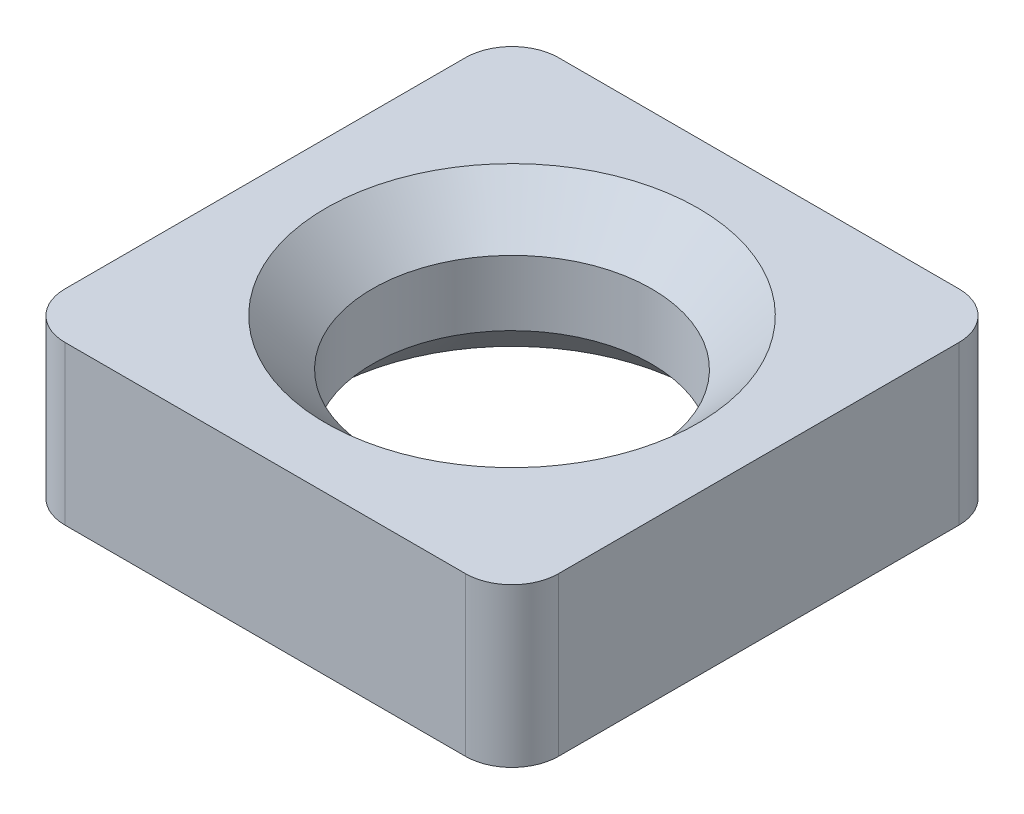
ISO-10303-21;
HEADER;
FILE_DESCRIPTION(('STEP AP214'),'2;1');
FILE_NAME('part.step','',(''),(''),'','','');
FILE_SCHEMA(('AUTOMOTIVE_DESIGN { 1 0 10303 214 1 1 1 1 }'));
ENDSEC;
DATA;
#1=APPLICATION_CONTEXT('core data for automotive mechanical design processes');
#2=APPLICATION_PROTOCOL_DEFINITION('international standard','automotive_design',2000,#1);
#3=PRODUCT_CONTEXT('',#1,'mechanical');
#4=PRODUCT('Part','Part','',(#3));
#5=PRODUCT_RELATED_PRODUCT_CATEGORY('part','',(#4));
#6=PRODUCT_DEFINITION_FORMATION('','',#4);
#7=PRODUCT_DEFINITION_CONTEXT('part definition',#1,'design');
#8=PRODUCT_DEFINITION('design','',#6,#7);
#9=PRODUCT_DEFINITION_SHAPE('','',#8);
#10=(LENGTH_UNIT() NAMED_UNIT(*) SI_UNIT(.MILLI.,.METRE.));
#11=(NAMED_UNIT(*) PLANE_ANGLE_UNIT() SI_UNIT($,.RADIAN.));
#12=(NAMED_UNIT(*) SI_UNIT($,.STERADIAN.) SOLID_ANGLE_UNIT());
#13=UNCERTAINTY_MEASURE_WITH_UNIT(LENGTH_MEASURE(1.E-05),#10,'distance_accuracy_value','');
#14=(GEOMETRIC_REPRESENTATION_CONTEXT(3) GLOBAL_UNCERTAINTY_ASSIGNED_CONTEXT((#13)) GLOBAL_UNIT_ASSIGNED_CONTEXT((#10,
#11,#12)) REPRESENTATION_CONTEXT('',''));
#15=CARTESIAN_POINT('',(0.,0.,0.));
#16=DIRECTION('',(0.,0.,1.));
#17=DIRECTION('',(1.,0.,0.));
#18=AXIS2_PLACEMENT_3D('',#15,#16,#17);
#19=CARTESIAN_POINT('',(0.,1.7,0.));
#20=DIRECTION('',(0.,-1.,0.));
#21=DIRECTION('',(0.,0.,-1.));
#22=AXIS2_PLACEMENT_3D('',#19,#20,#21);
#23=PLANE('',#22);
#24=CARTESIAN_POINT('',(0.,1.7,0.));
#25=DIRECTION('',(0.,-1.,0.));
#26=DIRECTION('',(0.,0.,-1.));
#27=AXIS2_PLACEMENT_3D('',#24,#25,#26);
#28=CIRCLE('',#27,2.);
#29=CARTESIAN_POINT('',(0.,1.7,-2.));
#30=VERTEX_POINT('',#29);
#31=EDGE_CURVE('E11',#30,#30,#28,.T.);
#32=ORIENTED_EDGE('',*,*,#31,.T.);
#33=EDGE_LOOP('',(#32));
#34=FACE_BOUND('',#33,.T.);
#35=DIRECTION('',(-1.,0.,0.));
#36=VECTOR('',#35,1.);
#37=CARTESIAN_POINT('',(-2.65,1.7,-2.65));
#38=LINE('',#37,#36);
#39=CARTESIAN_POINT('',(2.15,1.7,-2.65));
#40=VERTEX_POINT('',#39);
#41=CARTESIAN_POINT('',(-2.15,1.7,-2.65));
#42=VERTEX_POINT('',#41);
#43=EDGE_CURVE('E232',#40,#42,#38,.T.);
#44=ORIENTED_EDGE('',*,*,#43,.T.);
#45=CARTESIAN_POINT('',(-2.15,1.7,-2.15));
#46=DIRECTION('',(0.,-1.,0.));
#47=DIRECTION('',(0.,0.,-1.));
#48=AXIS2_PLACEMENT_3D('',#45,#46,#47);
#49=CIRCLE('',#48,0.5);
#50=CARTESIAN_POINT('',(-2.65,1.7,-2.15));
#51=VERTEX_POINT('',#50);
#52=EDGE_CURVE('E154',#42,#51,#49,.F.);
#53=ORIENTED_EDGE('',*,*,#52,.T.);
#54=DIRECTION('',(0.,0.,1.));
#55=VECTOR('',#54,1.);
#56=CARTESIAN_POINT('',(-2.65,1.7,2.65));
#57=LINE('',#56,#55);
#58=CARTESIAN_POINT('',(-2.65,1.7,2.15));
#59=VERTEX_POINT('',#58);
#60=EDGE_CURVE('E125',#51,#59,#57,.T.);
#61=ORIENTED_EDGE('',*,*,#60,.T.);
#62=CARTESIAN_POINT('',(-2.15,1.7,2.15));
#63=DIRECTION('',(0.,-1.,0.));
#64=DIRECTION('',(0.,0.,-1.));
#65=AXIS2_PLACEMENT_3D('',#62,#63,#64);
#66=CIRCLE('',#65,0.5);
#67=CARTESIAN_POINT('',(-2.15,1.7,2.65));
#68=VERTEX_POINT('',#67);
#69=EDGE_CURVE('E61',#59,#68,#66,.F.);
#70=ORIENTED_EDGE('',*,*,#69,.T.);
#71=DIRECTION('',(1.,0.,0.));
#72=VECTOR('',#71,1.);
#73=CARTESIAN_POINT('',(-2.65,1.7,2.65));
#74=LINE('',#73,#72);
#75=CARTESIAN_POINT('',(2.15,1.7,2.65));
#76=VERTEX_POINT('',#75);
#77=EDGE_CURVE('E140',#68,#76,#74,.T.);
#78=ORIENTED_EDGE('',*,*,#77,.T.);
#79=CARTESIAN_POINT('',(2.15,1.7,2.15));
#80=DIRECTION('',(0.,-1.,0.));
#81=DIRECTION('',(0.,0.,-1.));
#82=AXIS2_PLACEMENT_3D('',#79,#80,#81);
#83=CIRCLE('',#82,0.5);
#84=CARTESIAN_POINT('',(2.65,1.7,2.15));
#85=VERTEX_POINT('',#84);
#86=EDGE_CURVE('E149',#76,#85,#83,.F.);
#87=ORIENTED_EDGE('',*,*,#86,.T.);
#88=DIRECTION('',(0.,0.,-1.));
#89=VECTOR('',#88,1.);
#90=CARTESIAN_POINT('',(2.65,1.7,2.65));
#91=LINE('',#90,#89);
#92=CARTESIAN_POINT('',(2.65,1.7,-2.15));
#93=VERTEX_POINT('',#92);
#94=EDGE_CURVE('E134',#85,#93,#91,.T.);
#95=ORIENTED_EDGE('',*,*,#94,.T.);
#96=CARTESIAN_POINT('',(2.15,1.7,-2.15));
#97=DIRECTION('',(0.,-1.,0.));
#98=DIRECTION('',(0.,0.,-1.));
#99=AXIS2_PLACEMENT_3D('',#96,#97,#98);
#100=CIRCLE('',#99,0.5);
#101=EDGE_CURVE('E151',#93,#40,#100,.F.);
#102=ORIENTED_EDGE('',*,*,#101,.T.);
#103=EDGE_LOOP('',(#44,#53,#61,#70,#78,#87,#95,#102));
#104=FACE_BOUND('',#103,.T.);
#105=ADVANCED_FACE('F38',(#34,#104),#23,.F.);
#106=CARTESIAN_POINT('',(0.,0.,0.));
#107=DIRECTION('',(0.,-1.,0.));
#108=DIRECTION('',(0.,0.,-1.));
#109=AXIS2_PLACEMENT_3D('',#106,#107,#108);
#110=PLANE('',#109);
#111=CARTESIAN_POINT('',(0.,0.,0.));
#112=DIRECTION('',(0.,-1.,0.));
#113=DIRECTION('',(0.,0.,-1.));
#114=AXIS2_PLACEMENT_3D('',#111,#112,#113);
#115=CIRCLE('',#114,2.);
#116=CARTESIAN_POINT('',(0.,0.,-2.));
#117=VERTEX_POINT('',#116);
#118=EDGE_CURVE('E165',#117,#117,#115,.F.);
#119=ORIENTED_EDGE('',*,*,#118,.T.);
#120=EDGE_LOOP('',(#119));
#121=FACE_BOUND('',#120,.T.);
#122=DIRECTION('',(0.,0.,1.));
#123=VECTOR('',#122,1.);
#124=CARTESIAN_POINT('',(-2.65,0.,2.65));
#125=LINE('',#124,#123);
#126=CARTESIAN_POINT('',(-2.65,0.,-2.15));
#127=VERTEX_POINT('',#126);
#128=CARTESIAN_POINT('',(-2.65,0.,2.15));
#129=VERTEX_POINT('',#128);
#130=EDGE_CURVE('E123',#127,#129,#125,.T.);
#131=ORIENTED_EDGE('',*,*,#130,.F.);
#132=CARTESIAN_POINT('',(-2.15,0.,-2.15));
#133=DIRECTION('',(0.,-1.,0.));
#134=DIRECTION('',(0.,0.,-1.));
#135=AXIS2_PLACEMENT_3D('',#132,#133,#134);
#136=CIRCLE('',#135,0.5);
#137=CARTESIAN_POINT('',(-2.15,0.,-2.65));
#138=VERTEX_POINT('',#137);
#139=EDGE_CURVE('E106',#127,#138,#136,.T.);
#140=ORIENTED_EDGE('',*,*,#139,.T.);
#141=DIRECTION('',(-1.,0.,0.));
#142=VECTOR('',#141,1.);
#143=CARTESIAN_POINT('',(-2.65,0.,-2.65));
#144=LINE('',#143,#142);
#145=CARTESIAN_POINT('',(2.15,0.,-2.65));
#146=VERTEX_POINT('',#145);
#147=EDGE_CURVE('E132',#146,#138,#144,.T.);
#148=ORIENTED_EDGE('',*,*,#147,.F.);
#149=CARTESIAN_POINT('',(2.15,0.,-2.15));
#150=DIRECTION('',(0.,-1.,0.));
#151=DIRECTION('',(0.,0.,-1.));
#152=AXIS2_PLACEMENT_3D('',#149,#150,#151);
#153=CIRCLE('',#152,0.5);
#154=CARTESIAN_POINT('',(2.65,0.,-2.15));
#155=VERTEX_POINT('',#154);
#156=EDGE_CURVE('E143',#146,#155,#153,.T.);
#157=ORIENTED_EDGE('',*,*,#156,.T.);
#158=DIRECTION('',(0.,0.,-1.));
#159=VECTOR('',#158,1.);
#160=CARTESIAN_POINT('',(2.65,0.,2.65));
#161=LINE('',#160,#159);
#162=CARTESIAN_POINT('',(2.65,0.,2.15));
#163=VERTEX_POINT('',#162);
#164=EDGE_CURVE('E136',#163,#155,#161,.T.);
#165=ORIENTED_EDGE('',*,*,#164,.F.);
#166=CARTESIAN_POINT('',(2.15,0.,2.15));
#167=DIRECTION('',(0.,-1.,0.));
#168=DIRECTION('',(0.,0.,-1.));
#169=AXIS2_PLACEMENT_3D('',#166,#167,#168);
#170=CIRCLE('',#169,0.5);
#171=CARTESIAN_POINT('',(2.15,0.,2.65));
#172=VERTEX_POINT('',#171);
#173=EDGE_CURVE('E126',#163,#172,#170,.T.);
#174=ORIENTED_EDGE('',*,*,#173,.T.);
#175=DIRECTION('',(1.,0.,0.));
#176=VECTOR('',#175,1.);
#177=CARTESIAN_POINT('',(-2.65,0.,2.65));
#178=LINE('',#177,#176);
#179=CARTESIAN_POINT('',(-2.15,0.,2.65));
#180=VERTEX_POINT('',#179);
#181=EDGE_CURVE('E131',#180,#172,#178,.T.);
#182=ORIENTED_EDGE('',*,*,#181,.F.);
#183=CARTESIAN_POINT('',(-2.15,0.,2.15));
#184=DIRECTION('',(0.,-1.,0.));
#185=DIRECTION('',(0.,0.,-1.));
#186=AXIS2_PLACEMENT_3D('',#183,#184,#185);
#187=CIRCLE('',#186,0.5);
#188=EDGE_CURVE('E117',#180,#129,#187,.T.);
#189=ORIENTED_EDGE('',*,*,#188,.T.);
#190=EDGE_LOOP('',(#131,#140,#148,#157,#165,#174,#182,#189));
#191=FACE_BOUND('',#190,.T.);
#192=ADVANCED_FACE('F129',(#121,#191),#110,.T.);
#193=CARTESIAN_POINT('',(2.65,1.7,2.65));
#194=DIRECTION('',(-1.,0.,0.));
#195=DIRECTION('',(0.,0.,1.));
#196=AXIS2_PLACEMENT_3D('',#193,#194,#195);
#197=PLANE('',#196);
#198=ORIENTED_EDGE('',*,*,#164,.T.);
#199=DIRECTION('',(0.,-1.,0.));
#200=VECTOR('',#199,1.);
#201=CARTESIAN_POINT('',(2.65,1.7,-2.15));
#202=LINE('',#201,#200);
#203=EDGE_CURVE('E163',#155,#93,#202,.F.);
#204=ORIENTED_EDGE('',*,*,#203,.T.);
#205=ORIENTED_EDGE('',*,*,#94,.F.);
#206=DIRECTION('',(0.,-1.,0.));
#207=VECTOR('',#206,1.);
#208=CARTESIAN_POINT('',(2.65,1.7,2.15));
#209=LINE('',#208,#207);
#210=EDGE_CURVE('E160',#85,#163,#209,.T.);
#211=ORIENTED_EDGE('',*,*,#210,.T.);
#212=EDGE_LOOP('',(#198,#204,#205,#211));
#213=FACE_BOUND('',#212,.T.);
#214=ADVANCED_FACE('F183',(#213),#197,.F.);
#215=CARTESIAN_POINT('',(-2.65,1.7,-2.65));
#216=DIRECTION('',(0.,0.,1.));
#217=DIRECTION('',(1.,0.,0.));
#218=AXIS2_PLACEMENT_3D('',#215,#216,#217);
#219=PLANE('',#218);
#220=ORIENTED_EDGE('',*,*,#147,.T.);
#221=DIRECTION('',(0.,-1.,0.));
#222=VECTOR('',#221,1.);
#223=CARTESIAN_POINT('',(-2.15,1.7,-2.65));
#224=LINE('',#223,#222);
#225=EDGE_CURVE('E111',#138,#42,#224,.F.);
#226=ORIENTED_EDGE('',*,*,#225,.T.);
#227=ORIENTED_EDGE('',*,*,#43,.F.);
#228=DIRECTION('',(0.,-1.,0.));
#229=VECTOR('',#228,1.);
#230=CARTESIAN_POINT('',(2.15,1.7,-2.65));
#231=LINE('',#230,#229);
#232=EDGE_CURVE('E116',#40,#146,#231,.T.);
#233=ORIENTED_EDGE('',*,*,#232,.T.);
#234=EDGE_LOOP('',(#220,#226,#227,#233));
#235=FACE_BOUND('',#234,.T.);
#236=ADVANCED_FACE('F189',(#235),#219,.F.);
#237=CARTESIAN_POINT('',(-2.65,1.7,2.65));
#238=DIRECTION('',(1.,0.,0.));
#239=DIRECTION('',(0.,0.,-1.));
#240=AXIS2_PLACEMENT_3D('',#237,#238,#239);
#241=PLANE('',#240);
#242=ORIENTED_EDGE('',*,*,#60,.F.);
#243=DIRECTION('',(0.,-1.,0.));
#244=VECTOR('',#243,1.);
#245=CARTESIAN_POINT('',(-2.65,1.7,-2.15));
#246=LINE('',#245,#244);
#247=EDGE_CURVE('E110',#51,#127,#246,.T.);
#248=ORIENTED_EDGE('',*,*,#247,.T.);
#249=ORIENTED_EDGE('',*,*,#130,.T.);
#250=DIRECTION('',(0.,-1.,0.));
#251=VECTOR('',#250,1.);
#252=CARTESIAN_POINT('',(-2.65,1.7,2.15));
#253=LINE('',#252,#251);
#254=EDGE_CURVE('E127',#129,#59,#253,.F.);
#255=ORIENTED_EDGE('',*,*,#254,.T.);
#256=EDGE_LOOP('',(#242,#248,#249,#255));
#257=FACE_BOUND('',#256,.T.);
#258=ADVANCED_FACE('F122',(#257),#241,.F.);
#259=CARTESIAN_POINT('',(-2.65,1.7,2.65));
#260=DIRECTION('',(0.,0.,-1.));
#261=DIRECTION('',(-1.,0.,0.));
#262=AXIS2_PLACEMENT_3D('',#259,#260,#261);
#263=PLANE('',#262);
#264=ORIENTED_EDGE('',*,*,#77,.F.);
#265=DIRECTION('',(0.,-1.,0.));
#266=VECTOR('',#265,1.);
#267=CARTESIAN_POINT('',(-2.15,1.7,2.65));
#268=LINE('',#267,#266);
#269=EDGE_CURVE('E157',#68,#180,#268,.T.);
#270=ORIENTED_EDGE('',*,*,#269,.T.);
#271=ORIENTED_EDGE('',*,*,#181,.T.);
#272=DIRECTION('',(0.,-1.,0.));
#273=VECTOR('',#272,1.);
#274=CARTESIAN_POINT('',(2.15,1.7,2.65));
#275=LINE('',#274,#273);
#276=EDGE_CURVE('E54',#172,#76,#275,.F.);
#277=ORIENTED_EDGE('',*,*,#276,.T.);
#278=EDGE_LOOP('',(#264,#270,#271,#277));
#279=FACE_BOUND('',#278,.T.);
#280=ADVANCED_FACE('F196',(#279),#263,.F.);
#281=CARTESIAN_POINT('',(0.,1.7,0.));
#282=DIRECTION('',(0.,-1.,0.));
#283=DIRECTION('',(0.,0.,-1.));
#284=AXIS2_PLACEMENT_3D('',#281,#282,#283);
#285=CYLINDRICAL_SURFACE('',#284,1.5);
#286=CARTESIAN_POINT('',(0.,0.500000000000002,0.));
#287=DIRECTION('',(0.,-1.,0.));
#288=DIRECTION('',(0.,0.,-1.));
#289=AXIS2_PLACEMENT_3D('',#286,#287,#288);
#290=CIRCLE('',#289,1.5);
#291=CARTESIAN_POINT('',(0.,0.500000000000002,-1.5));
#292=VERTEX_POINT('',#291);
#293=EDGE_CURVE('E47',#292,#292,#290,.T.);
#294=ORIENTED_EDGE('',*,*,#293,.T.);
#295=EDGE_LOOP('',(#294));
#296=FACE_BOUND('',#295,.T.);
#297=CARTESIAN_POINT('',(0.,1.2,0.));
#298=DIRECTION('',(0.,-1.,0.));
#299=DIRECTION('',(0.,0.,-1.));
#300=AXIS2_PLACEMENT_3D('',#297,#298,#299);
#301=CIRCLE('',#300,1.5);
#302=CARTESIAN_POINT('',(0.,1.2,-1.5));
#303=VERTEX_POINT('',#302);
#304=EDGE_CURVE('E168',#303,#303,#301,.F.);
#305=ORIENTED_EDGE('',*,*,#304,.T.);
#306=EDGE_LOOP('',(#305));
#307=FACE_BOUND('',#306,.T.);
#308=ADVANCED_FACE('F173',(#296,#307),#285,.F.);
#309=CARTESIAN_POINT('',(-2.15,1.7,-2.15));
#310=DIRECTION('',(0.,-1.,0.));
#311=DIRECTION('',(0.,0.,-1.));
#312=AXIS2_PLACEMENT_3D('',#309,#310,#311);
#313=CYLINDRICAL_SURFACE('',#312,0.5);
#314=ORIENTED_EDGE('',*,*,#52,.F.);
#315=ORIENTED_EDGE('',*,*,#225,.F.);
#316=ORIENTED_EDGE('',*,*,#139,.F.);
#317=ORIENTED_EDGE('',*,*,#247,.F.);
#318=EDGE_LOOP('',(#314,#315,#316,#317));
#319=FACE_BOUND('',#318,.T.);
#320=ADVANCED_FACE('F109',(#319),#313,.T.);
#321=CARTESIAN_POINT('',(-2.15,1.7,2.15));
#322=DIRECTION('',(0.,-1.,0.));
#323=DIRECTION('',(0.,0.,-1.));
#324=AXIS2_PLACEMENT_3D('',#321,#322,#323);
#325=CYLINDRICAL_SURFACE('',#324,0.5);
#326=ORIENTED_EDGE('',*,*,#69,.F.);
#327=ORIENTED_EDGE('',*,*,#254,.F.);
#328=ORIENTED_EDGE('',*,*,#188,.F.);
#329=ORIENTED_EDGE('',*,*,#269,.F.);
#330=EDGE_LOOP('',(#326,#327,#328,#329));
#331=FACE_BOUND('',#330,.T.);
#332=ADVANCED_FACE('F206',(#331),#325,.T.);
#333=CARTESIAN_POINT('',(2.15,1.7,-2.15));
#334=DIRECTION('',(0.,-1.,0.));
#335=DIRECTION('',(0.,0.,-1.));
#336=AXIS2_PLACEMENT_3D('',#333,#334,#335);
#337=CYLINDRICAL_SURFACE('',#336,0.5);
#338=ORIENTED_EDGE('',*,*,#101,.F.);
#339=ORIENTED_EDGE('',*,*,#203,.F.);
#340=ORIENTED_EDGE('',*,*,#156,.F.);
#341=ORIENTED_EDGE('',*,*,#232,.F.);
#342=EDGE_LOOP('',(#338,#339,#340,#341));
#343=FACE_BOUND('',#342,.T.);
#344=ADVANCED_FACE('F209',(#343),#337,.T.);
#345=CARTESIAN_POINT('',(2.15,1.7,2.15));
#346=DIRECTION('',(0.,-1.,0.));
#347=DIRECTION('',(0.,0.,-1.));
#348=AXIS2_PLACEMENT_3D('',#345,#346,#347);
#349=CYLINDRICAL_SURFACE('',#348,0.5);
#350=ORIENTED_EDGE('',*,*,#86,.F.);
#351=ORIENTED_EDGE('',*,*,#276,.F.);
#352=ORIENTED_EDGE('',*,*,#173,.F.);
#353=ORIENTED_EDGE('',*,*,#210,.F.);
#354=EDGE_LOOP('',(#350,#351,#352,#353));
#355=FACE_BOUND('',#354,.T.);
#356=ADVANCED_FACE('F179',(#355),#349,.T.);
#357=CARTESIAN_POINT('',(0.,0.,0.));
#358=DIRECTION('',(0.,-1.,0.));
#359=DIRECTION('',(0.,0.,-1.));
#360=AXIS2_PLACEMENT_3D('',#357,#358,#359);
#361=CONICAL_SURFACE('',#360,2.,0.785398163397447);
#362=ORIENTED_EDGE('',*,*,#293,.F.);
#363=EDGE_LOOP('',(#362));
#364=FACE_BOUND('',#363,.T.);
#365=ORIENTED_EDGE('',*,*,#118,.F.);
#366=EDGE_LOOP('',(#365));
#367=FACE_BOUND('',#366,.T.);
#368=ADVANCED_FACE('F176',(#364,#367),#361,.F.);
#369=CARTESIAN_POINT('',(0.,1.2,0.));
#370=DIRECTION('',(0.,1.,0.));
#371=DIRECTION('',(0.,0.,1.));
#372=AXIS2_PLACEMENT_3D('',#369,#370,#371);
#373=CONICAL_SURFACE('',#372,1.5,0.785398163397451);
#374=ORIENTED_EDGE('',*,*,#31,.F.);
#375=EDGE_LOOP('',(#374));
#376=FACE_BOUND('',#375,.T.);
#377=ORIENTED_EDGE('',*,*,#304,.F.);
#378=EDGE_LOOP('',(#377));
#379=FACE_BOUND('',#378,.T.);
#380=ADVANCED_FACE('F41',(#376,#379),#373,.F.);
#381=CLOSED_SHELL('',(#105,#192,#214,#236,#258,#280,#308,#320,#332,#344,#356,#368,#380));
#382=MANIFOLD_SOLID_BREP('B2',#381);
#383=ADVANCED_BREP_SHAPE_REPRESENTATION('',(#18,#382),#14);
#384=SHAPE_DEFINITION_REPRESENTATION(#9,#383);
ENDSEC;
END-ISO-10303-21;
